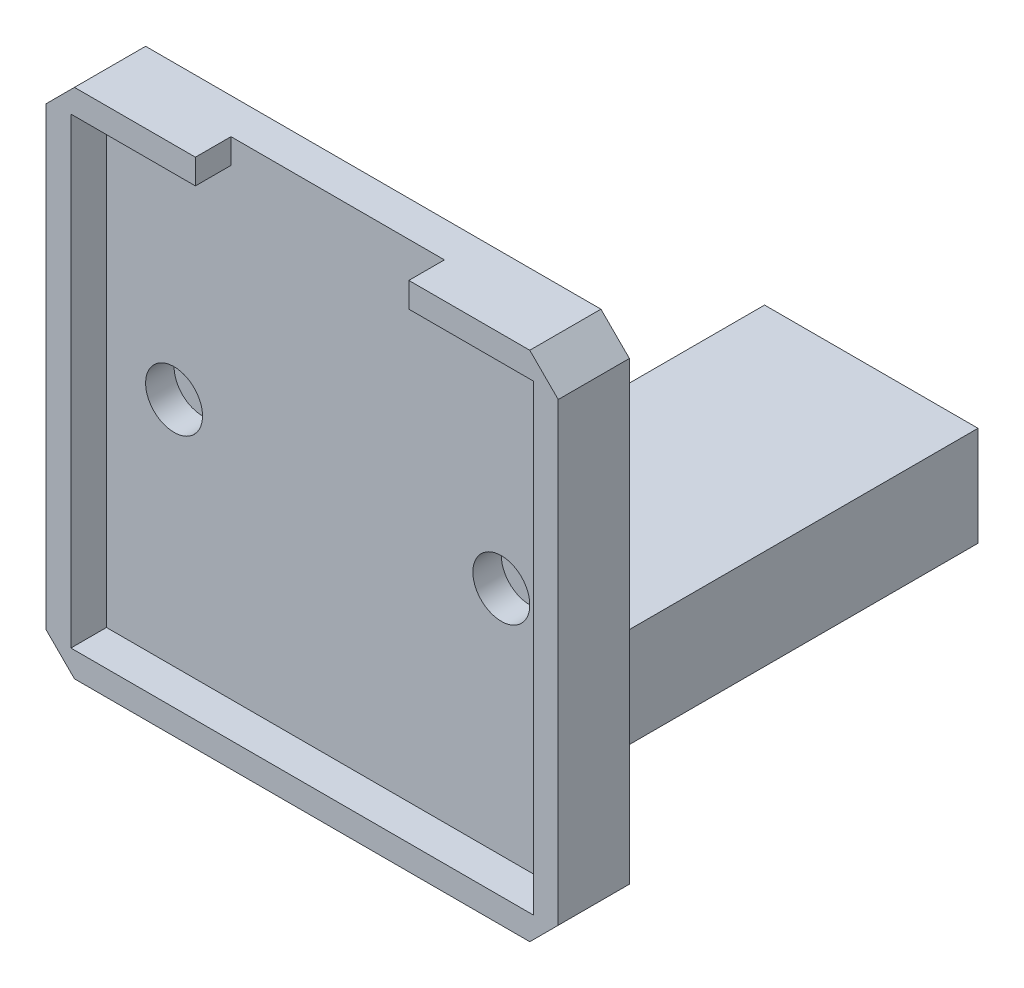
ISO-10303-21;
HEADER;
FILE_DESCRIPTION(('STEP AP214'),'2;1');
FILE_NAME('part.step','',(''),(''),'','','');
FILE_SCHEMA(('AUTOMOTIVE_DESIGN { 1 0 10303 214 1 1 1 1 }'));
ENDSEC;
DATA;
#1=APPLICATION_CONTEXT('core data for automotive mechanical design processes');
#2=APPLICATION_PROTOCOL_DEFINITION('international standard','automotive_design',2000,#1);
#3=PRODUCT_CONTEXT('',#1,'mechanical');
#4=PRODUCT('Part','Part','',(#3));
#5=PRODUCT_RELATED_PRODUCT_CATEGORY('part','',(#4));
#6=PRODUCT_DEFINITION_FORMATION('','',#4);
#7=PRODUCT_DEFINITION_CONTEXT('part definition',#1,'design');
#8=PRODUCT_DEFINITION('design','',#6,#7);
#9=PRODUCT_DEFINITION_SHAPE('','',#8);
#10=(LENGTH_UNIT() NAMED_UNIT(*) SI_UNIT(.MILLI.,.METRE.));
#11=(NAMED_UNIT(*) PLANE_ANGLE_UNIT() SI_UNIT($,.RADIAN.));
#12=(NAMED_UNIT(*) SI_UNIT($,.STERADIAN.) SOLID_ANGLE_UNIT());
#13=UNCERTAINTY_MEASURE_WITH_UNIT(LENGTH_MEASURE(1.E-05),#10,'distance_accuracy_value','');
#14=(GEOMETRIC_REPRESENTATION_CONTEXT(3) GLOBAL_UNCERTAINTY_ASSIGNED_CONTEXT((#13)) GLOBAL_UNIT_ASSIGNED_CONTEXT((#10,
#11,#12)) REPRESENTATION_CONTEXT('',''));
#15=CARTESIAN_POINT('',(0.,0.,0.));
#16=DIRECTION('',(0.,0.,1.));
#17=DIRECTION('',(1.,0.,0.));
#18=AXIS2_PLACEMENT_3D('',#15,#16,#17);
#19=CARTESIAN_POINT('',(-18.,18.,5.));
#20=DIRECTION('',(0.,-1.,0.));
#21=DIRECTION('',(0.,0.,-1.));
#22=AXIS2_PLACEMENT_3D('',#19,#20,#21);
#23=PLANE('',#22);
#24=DIRECTION('',(-1.,0.,0.));
#25=VECTOR('',#24,1.);
#26=CARTESIAN_POINT('',(-18.,18.,0.));
#27=LINE('',#26,#25);
#28=CARTESIAN_POINT('',(16.,18.,0.));
#29=VERTEX_POINT('',#28);
#30=CARTESIAN_POINT('',(-16.,18.,0.));
#31=VERTEX_POINT('',#30);
#32=EDGE_CURVE('E299',#29,#31,#27,.T.);
#33=ORIENTED_EDGE('',*,*,#32,.T.);
#34=DIRECTION('',(0.,0.,1.));
#35=VECTOR('',#34,1.);
#36=CARTESIAN_POINT('',(-16.,18.,5.));
#37=LINE('',#36,#35);
#38=CARTESIAN_POINT('',(-16.,18.,5.));
#39=VERTEX_POINT('',#38);
#40=EDGE_CURVE('E338',#31,#39,#37,.T.);
#41=ORIENTED_EDGE('',*,*,#40,.T.);
#42=DIRECTION('',(-1.,0.,0.));
#43=VECTOR('',#42,1.);
#44=CARTESIAN_POINT('',(-18.,18.,5.));
#45=LINE('',#44,#43);
#46=CARTESIAN_POINT('',(-7.5,18.,5.));
#47=VERTEX_POINT('',#46);
#48=EDGE_CURVE('E286',#47,#39,#45,.T.);
#49=ORIENTED_EDGE('',*,*,#48,.F.);
#50=DIRECTION('',(0.,0.,1.));
#51=VECTOR('',#50,1.);
#52=CARTESIAN_POINT('',(-7.5,18.,2.5));
#53=LINE('',#52,#51);
#54=CARTESIAN_POINT('',(-7.5,18.,2.5));
#55=VERTEX_POINT('',#54);
#56=EDGE_CURVE('E274',#55,#47,#53,.T.);
#57=ORIENTED_EDGE('',*,*,#56,.F.);
#58=DIRECTION('',(-1.,0.,0.));
#59=VECTOR('',#58,1.);
#60=CARTESIAN_POINT('',(0.,18.,2.5));
#61=LINE('',#60,#59);
#62=CARTESIAN_POINT('',(7.5,18.,2.5));
#63=VERTEX_POINT('',#62);
#64=EDGE_CURVE('E236',#63,#55,#61,.T.);
#65=ORIENTED_EDGE('',*,*,#64,.F.);
#66=DIRECTION('',(0.,0.,1.));
#67=VECTOR('',#66,1.);
#68=CARTESIAN_POINT('',(7.5,18.,2.5));
#69=LINE('',#68,#67);
#70=CARTESIAN_POINT('',(7.5,18.,5.));
#71=VERTEX_POINT('',#70);
#72=EDGE_CURVE('E276',#63,#71,#69,.T.);
#73=ORIENTED_EDGE('',*,*,#72,.T.);
#74=CARTESIAN_POINT('',(16.,18.,5.));
#75=VERTEX_POINT('',#74);
#76=EDGE_CURVE('E288',#75,#71,#45,.T.);
#77=ORIENTED_EDGE('',*,*,#76,.F.);
#78=DIRECTION('',(0.,0.,-1.));
#79=VECTOR('',#78,1.);
#80=CARTESIAN_POINT('',(16.,18.,5.));
#81=LINE('',#80,#79);
#82=EDGE_CURVE('E335',#75,#29,#81,.T.);
#83=ORIENTED_EDGE('',*,*,#82,.T.);
#84=EDGE_LOOP('',(#33,#41,#49,#57,#65,#73,#77,#83));
#85=FACE_BOUND('',#84,.T.);
#86=ADVANCED_FACE('F34',(#85),#23,.F.);
#87=CARTESIAN_POINT('',(0.,0.,5.));
#88=DIRECTION('',(0.,0.,1.));
#89=DIRECTION('',(1.,0.,0.));
#90=AXIS2_PLACEMENT_3D('',#87,#88,#89);
#91=PLANE('',#90);
#92=ORIENTED_EDGE('',*,*,#48,.T.);
#93=DIRECTION('',(0.707106781186549,0.707106781186546,0.));
#94=VECTOR('',#93,1.);
#95=CARTESIAN_POINT('',(-17.,17.,5.));
#96=LINE('',#95,#94);
#97=CARTESIAN_POINT('',(-18.,16.,5.));
#98=VERTEX_POINT('',#97);
#99=EDGE_CURVE('E346',#39,#98,#96,.F.);
#100=ORIENTED_EDGE('',*,*,#99,.T.);
#101=DIRECTION('',(0.,-1.,0.));
#102=VECTOR('',#101,1.);
#103=CARTESIAN_POINT('',(-18.,18.,5.));
#104=LINE('',#103,#102);
#105=CARTESIAN_POINT('',(-18.,-16.,5.));
#106=VERTEX_POINT('',#105);
#107=EDGE_CURVE('E290',#98,#106,#104,.T.);
#108=ORIENTED_EDGE('',*,*,#107,.T.);
#109=DIRECTION('',(-0.707106781186546,0.707106781186549,0.));
#110=VECTOR('',#109,1.);
#111=CARTESIAN_POINT('',(-17.,-17.,5.));
#112=LINE('',#111,#110);
#113=CARTESIAN_POINT('',(-16.,-18.,5.));
#114=VERTEX_POINT('',#113);
#115=EDGE_CURVE('E344',#106,#114,#112,.F.);
#116=ORIENTED_EDGE('',*,*,#115,.T.);
#117=DIRECTION('',(1.,0.,0.));
#118=VECTOR('',#117,1.);
#119=CARTESIAN_POINT('',(-18.,-18.,5.));
#120=LINE('',#119,#118);
#121=CARTESIAN_POINT('',(16.,-18.,5.));
#122=VERTEX_POINT('',#121);
#123=EDGE_CURVE('E293',#114,#122,#120,.T.);
#124=ORIENTED_EDGE('',*,*,#123,.T.);
#125=DIRECTION('',(-0.707106781186549,-0.707106781186546,0.));
#126=VECTOR('',#125,1.);
#127=CARTESIAN_POINT('',(17.,-17.,5.));
#128=LINE('',#127,#126);
#129=CARTESIAN_POINT('',(18.,-16.,5.));
#130=VERTEX_POINT('',#129);
#131=EDGE_CURVE('E342',#122,#130,#128,.F.);
#132=ORIENTED_EDGE('',*,*,#131,.T.);
#133=DIRECTION('',(0.,1.,0.));
#134=VECTOR('',#133,1.);
#135=CARTESIAN_POINT('',(18.,18.,5.));
#136=LINE('',#135,#134);
#137=CARTESIAN_POINT('',(18.,16.,5.));
#138=VERTEX_POINT('',#137);
#139=EDGE_CURVE('E283',#130,#138,#136,.T.);
#140=ORIENTED_EDGE('',*,*,#139,.T.);
#141=DIRECTION('',(0.707106781186546,-0.707106781186549,0.));
#142=VECTOR('',#141,1.);
#143=CARTESIAN_POINT('',(17.,17.,5.));
#144=LINE('',#143,#142);
#145=EDGE_CURVE('E340',#138,#75,#144,.F.);
#146=ORIENTED_EDGE('',*,*,#145,.T.);
#147=ORIENTED_EDGE('',*,*,#76,.T.);
#148=DIRECTION('',(0.,1.,0.));
#149=VECTOR('',#148,1.);
#150=CARTESIAN_POINT('',(7.5,0.,5.));
#151=LINE('',#150,#149);
#152=CARTESIAN_POINT('',(7.5,16.25,5.));
#153=VERTEX_POINT('',#152);
#154=EDGE_CURVE('E253',#153,#71,#151,.T.);
#155=ORIENTED_EDGE('',*,*,#154,.F.);
#156=DIRECTION('',(1.,0.,0.));
#157=VECTOR('',#156,1.);
#158=CARTESIAN_POINT('',(0.,16.25,5.));
#159=LINE('',#158,#157);
#160=CARTESIAN_POINT('',(16.25,16.25,5.));
#161=VERTEX_POINT('',#160);
#162=EDGE_CURVE('E250',#153,#161,#159,.T.);
#163=ORIENTED_EDGE('',*,*,#162,.T.);
#164=DIRECTION('',(0.,-1.,0.));
#165=VECTOR('',#164,1.);
#166=CARTESIAN_POINT('',(16.25,0.,5.));
#167=LINE('',#166,#165);
#168=CARTESIAN_POINT('',(16.25,-16.25,5.));
#169=VERTEX_POINT('',#168);
#170=EDGE_CURVE('E209',#161,#169,#167,.T.);
#171=ORIENTED_EDGE('',*,*,#170,.T.);
#172=DIRECTION('',(1.,0.,0.));
#173=VECTOR('',#172,1.);
#174=CARTESIAN_POINT('',(0.,-16.25,5.));
#175=LINE('',#174,#173);
#176=CARTESIAN_POINT('',(-16.25,-16.25,5.));
#177=VERTEX_POINT('',#176);
#178=EDGE_CURVE('E230',#177,#169,#175,.T.);
#179=ORIENTED_EDGE('',*,*,#178,.F.);
#180=DIRECTION('',(0.,-1.,0.));
#181=VECTOR('',#180,1.);
#182=CARTESIAN_POINT('',(-16.25,0.,5.));
#183=LINE('',#182,#181);
#184=CARTESIAN_POINT('',(-16.25,16.25,5.));
#185=VERTEX_POINT('',#184);
#186=EDGE_CURVE('E260',#185,#177,#183,.T.);
#187=ORIENTED_EDGE('',*,*,#186,.F.);
#188=CARTESIAN_POINT('',(-7.5,16.25,5.));
#189=VERTEX_POINT('',#188);
#190=EDGE_CURVE('E254',#185,#189,#159,.T.);
#191=ORIENTED_EDGE('',*,*,#190,.T.);
#192=DIRECTION('',(0.,1.,0.));
#193=VECTOR('',#192,1.);
#194=CARTESIAN_POINT('',(-7.5,0.,5.));
#195=LINE('',#194,#193);
#196=EDGE_CURVE('E257',#189,#47,#195,.T.);
#197=ORIENTED_EDGE('',*,*,#196,.T.);
#198=EDGE_LOOP('',(#92,#100,#108,#116,#124,#132,#140,#146,#147,#155,#163,#171,#179,#187,#191,#197));
#199=FACE_BOUND('',#198,.T.);
#200=ADVANCED_FACE('F390',(#199),#91,.T.);
#201=CARTESIAN_POINT('',(18.,18.,5.));
#202=DIRECTION('',(-1.,0.,0.));
#203=DIRECTION('',(0.,-1.,0.));
#204=AXIS2_PLACEMENT_3D('',#201,#202,#203);
#205=PLANE('',#204);
#206=ORIENTED_EDGE('',*,*,#139,.F.);
#207=DIRECTION('',(0.,0.,-1.));
#208=VECTOR('',#207,1.);
#209=CARTESIAN_POINT('',(18.,-16.,5.));
#210=LINE('',#209,#208);
#211=CARTESIAN_POINT('',(18.,-16.,0.));
#212=VERTEX_POINT('',#211);
#213=EDGE_CURVE('E355',#130,#212,#210,.T.);
#214=ORIENTED_EDGE('',*,*,#213,.T.);
#215=DIRECTION('',(0.,1.,0.));
#216=VECTOR('',#215,1.);
#217=CARTESIAN_POINT('',(18.,18.,0.));
#218=LINE('',#217,#216);
#219=CARTESIAN_POINT('',(18.,16.,0.));
#220=VERTEX_POINT('',#219);
#221=EDGE_CURVE('E267',#212,#220,#218,.T.);
#222=ORIENTED_EDGE('',*,*,#221,.T.);
#223=DIRECTION('',(0.,0.,1.));
#224=VECTOR('',#223,1.);
#225=CARTESIAN_POINT('',(18.,16.,5.));
#226=LINE('',#225,#224);
#227=EDGE_CURVE('E353',#220,#138,#226,.T.);
#228=ORIENTED_EDGE('',*,*,#227,.T.);
#229=EDGE_LOOP('',(#206,#214,#222,#228));
#230=FACE_BOUND('',#229,.T.);
#231=ADVANCED_FACE('F400',(#230),#205,.F.);
#232=CARTESIAN_POINT('',(-18.,18.,5.));
#233=DIRECTION('',(1.,0.,0.));
#234=DIRECTION('',(0.,1.,0.));
#235=AXIS2_PLACEMENT_3D('',#232,#233,#234);
#236=PLANE('',#235);
#237=ORIENTED_EDGE('',*,*,#107,.F.);
#238=DIRECTION('',(0.,0.,-1.));
#239=VECTOR('',#238,1.);
#240=CARTESIAN_POINT('',(-18.,16.,5.));
#241=LINE('',#240,#239);
#242=CARTESIAN_POINT('',(-18.,16.,0.));
#243=VERTEX_POINT('',#242);
#244=EDGE_CURVE('E324',#98,#243,#241,.T.);
#245=ORIENTED_EDGE('',*,*,#244,.T.);
#246=DIRECTION('',(0.,-1.,0.));
#247=VECTOR('',#246,1.);
#248=CARTESIAN_POINT('',(-18.,18.,0.));
#249=LINE('',#248,#247);
#250=CARTESIAN_POINT('',(-18.,-16.,0.));
#251=VERTEX_POINT('',#250);
#252=EDGE_CURVE('E302',#243,#251,#249,.T.);
#253=ORIENTED_EDGE('',*,*,#252,.T.);
#254=DIRECTION('',(0.,0.,1.));
#255=VECTOR('',#254,1.);
#256=CARTESIAN_POINT('',(-18.,-16.,5.));
#257=LINE('',#256,#255);
#258=EDGE_CURVE('E322',#251,#106,#257,.T.);
#259=ORIENTED_EDGE('',*,*,#258,.T.);
#260=EDGE_LOOP('',(#237,#245,#253,#259));
#261=FACE_BOUND('',#260,.T.);
#262=ADVANCED_FACE('F384',(#261),#236,.F.);
#263=CARTESIAN_POINT('',(-18.,-18.,5.));
#264=DIRECTION('',(0.,1.,0.));
#265=DIRECTION('',(0.,0.,1.));
#266=AXIS2_PLACEMENT_3D('',#263,#264,#265);
#267=PLANE('',#266);
#268=ORIENTED_EDGE('',*,*,#123,.F.);
#269=DIRECTION('',(0.,0.,-1.));
#270=VECTOR('',#269,1.);
#271=CARTESIAN_POINT('',(-16.,-18.,5.));
#272=LINE('',#271,#270);
#273=CARTESIAN_POINT('',(-16.,-18.,0.));
#274=VERTEX_POINT('',#273);
#275=EDGE_CURVE('E350',#114,#274,#272,.T.);
#276=ORIENTED_EDGE('',*,*,#275,.T.);
#277=DIRECTION('',(1.,0.,0.));
#278=VECTOR('',#277,1.);
#279=CARTESIAN_POINT('',(-18.,-18.,0.));
#280=LINE('',#279,#278);
#281=CARTESIAN_POINT('',(-12.5,-18.,0.));
#282=VERTEX_POINT('',#281);
#283=EDGE_CURVE('E287',#274,#282,#280,.T.);
#284=ORIENTED_EDGE('',*,*,#283,.T.);
#285=DIRECTION('',(-0.707106781186551,0.,0.707106781186544));
#286=VECTOR('',#285,1.);
#287=CARTESIAN_POINT('',(-17.75,-18.,5.24999999999995));
#288=LINE('',#287,#286);
#289=CARTESIAN_POINT('',(-7.5,-18.,-4.99999999999999));
#290=VERTEX_POINT('',#289);
#291=EDGE_CURVE('E314',#282,#290,#288,.F.);
#292=ORIENTED_EDGE('',*,*,#291,.T.);
#293=DIRECTION('',(0.,0.,-1.));
#294=VECTOR('',#293,1.);
#295=CARTESIAN_POINT('',(-7.5,-18.,0.));
#296=LINE('',#295,#294);
#297=CARTESIAN_POINT('',(-7.5,-18.,-35.));
#298=VERTEX_POINT('',#297);
#299=EDGE_CURVE('E206',#290,#298,#296,.T.);
#300=ORIENTED_EDGE('',*,*,#299,.T.);
#301=DIRECTION('',(-1.,0.,0.));
#302=VECTOR('',#301,1.);
#303=CARTESIAN_POINT('',(7.5,-18.,-35.));
#304=LINE('',#303,#302);
#305=CARTESIAN_POINT('',(7.5,-18.,-35.));
#306=VERTEX_POINT('',#305);
#307=EDGE_CURVE('E202',#306,#298,#304,.T.);
#308=ORIENTED_EDGE('',*,*,#307,.F.);
#309=DIRECTION('',(0.,0.,-1.));
#310=VECTOR('',#309,1.);
#311=CARTESIAN_POINT('',(7.5,-18.,0.));
#312=LINE('',#311,#310);
#313=CARTESIAN_POINT('',(7.5,-18.,-5.00000000000004));
#314=VERTEX_POINT('',#313);
#315=EDGE_CURVE('E189',#314,#306,#312,.T.);
#316=ORIENTED_EDGE('',*,*,#315,.F.);
#317=DIRECTION('',(0.707106781186544,0.,0.707106781186551));
#318=VECTOR('',#317,1.);
#319=CARTESIAN_POINT('',(-0.249999999999841,-18.,-12.75));
#320=LINE('',#319,#318);
#321=CARTESIAN_POINT('',(12.5,-18.,0.));
#322=VERTEX_POINT('',#321);
#323=EDGE_CURVE('E318',#314,#322,#320,.T.);
#324=ORIENTED_EDGE('',*,*,#323,.T.);
#325=CARTESIAN_POINT('',(16.,-18.,0.));
#326=VERTEX_POINT('',#325);
#327=EDGE_CURVE('E305',#322,#326,#280,.T.);
#328=ORIENTED_EDGE('',*,*,#327,.T.);
#329=DIRECTION('',(0.,0.,1.));
#330=VECTOR('',#329,1.);
#331=CARTESIAN_POINT('',(16.,-18.,5.));
#332=LINE('',#331,#330);
#333=EDGE_CURVE('E348',#326,#122,#332,.T.);
#334=ORIENTED_EDGE('',*,*,#333,.T.);
#335=EDGE_LOOP('',(#268,#276,#284,#292,#300,#308,#316,#324,#328,#334));
#336=FACE_BOUND('',#335,.T.);
#337=ADVANCED_FACE('F204',(#336),#267,.F.);
#338=CARTESIAN_POINT('',(0.,0.,0.));
#339=DIRECTION('',(0.,0.,1.));
#340=DIRECTION('',(1.,0.,0.));
#341=AXIS2_PLACEMENT_3D('',#338,#339,#340);
#342=PLANE('',#341);
#343=DIRECTION('',(-1.,0.,0.));
#344=VECTOR('',#343,1.);
#345=CARTESIAN_POINT('',(-12.5,-8.99999999999998,0.));
#346=LINE('',#345,#344);
#347=CARTESIAN_POINT('',(12.5,-8.99999999999998,0.));
#348=VERTEX_POINT('',#347);
#349=CARTESIAN_POINT('',(-12.5,-8.99999999999998,0.));
#350=VERTEX_POINT('',#349);
#351=EDGE_CURVE('E358',#348,#350,#346,.T.);
#352=ORIENTED_EDGE('',*,*,#351,.T.);
#353=DIRECTION('',(0.,-1.,0.));
#354=VECTOR('',#353,1.);
#355=CARTESIAN_POINT('',(-12.5,-18.,0.));
#356=LINE('',#355,#354);
#357=EDGE_CURVE('E308',#350,#282,#356,.T.);
#358=ORIENTED_EDGE('',*,*,#357,.T.);
#359=ORIENTED_EDGE('',*,*,#283,.F.);
#360=DIRECTION('',(0.707106781186546,-0.707106781186549,0.));
#361=VECTOR('',#360,1.);
#362=CARTESIAN_POINT('',(-16.,-18.,0.));
#363=LINE('',#362,#361);
#364=EDGE_CURVE('E331',#274,#251,#363,.F.);
#365=ORIENTED_EDGE('',*,*,#364,.T.);
#366=ORIENTED_EDGE('',*,*,#252,.F.);
#367=DIRECTION('',(-0.707106781186549,-0.707106781186546,0.));
#368=VECTOR('',#367,1.);
#369=CARTESIAN_POINT('',(-18.,16.,0.));
#370=LINE('',#369,#368);
#371=EDGE_CURVE('E333',#243,#31,#370,.F.);
#372=ORIENTED_EDGE('',*,*,#371,.T.);
#373=ORIENTED_EDGE('',*,*,#32,.F.);
#374=DIRECTION('',(-0.707106781186546,0.707106781186549,0.));
#375=VECTOR('',#374,1.);
#376=CARTESIAN_POINT('',(16.,18.,0.));
#377=LINE('',#376,#375);
#378=EDGE_CURVE('E327',#29,#220,#377,.F.);
#379=ORIENTED_EDGE('',*,*,#378,.T.);
#380=ORIENTED_EDGE('',*,*,#221,.F.);
#381=DIRECTION('',(0.707106781186549,0.707106781186546,0.));
#382=VECTOR('',#381,1.);
#383=CARTESIAN_POINT('',(18.,-16.,0.));
#384=LINE('',#383,#382);
#385=EDGE_CURVE('E329',#212,#326,#384,.F.);
#386=ORIENTED_EDGE('',*,*,#385,.T.);
#387=ORIENTED_EDGE('',*,*,#327,.F.);
#388=DIRECTION('',(0.,1.,0.));
#389=VECTOR('',#388,1.);
#390=CARTESIAN_POINT('',(12.5,0.,0.));
#391=LINE('',#390,#389);
#392=EDGE_CURVE('E296',#322,#348,#391,.T.);
#393=ORIENTED_EDGE('',*,*,#392,.T.);
#394=EDGE_LOOP('',(#352,#358,#359,#365,#366,#372,#373,#379,#380,#386,#387,#393));
#395=FACE_BOUND('',#394,.T.);
#396=ADVANCED_FACE('F363',(#395),#342,.F.);
#397=CARTESIAN_POINT('',(16.25,0.,2.5));
#398=DIRECTION('',(-1.,0.,0.));
#399=DIRECTION('',(0.,-1.,0.));
#400=AXIS2_PLACEMENT_3D('',#397,#398,#399);
#401=PLANE('',#400);
#402=ORIENTED_EDGE('',*,*,#170,.F.);
#403=DIRECTION('',(0.,0.,1.));
#404=VECTOR('',#403,1.);
#405=CARTESIAN_POINT('',(16.25,16.25,2.5));
#406=LINE('',#405,#404);
#407=CARTESIAN_POINT('',(16.25,16.25,2.5));
#408=VERTEX_POINT('',#407);
#409=EDGE_CURVE('E247',#408,#161,#406,.T.);
#410=ORIENTED_EDGE('',*,*,#409,.F.);
#411=DIRECTION('',(0.,-1.,0.));
#412=VECTOR('',#411,1.);
#413=CARTESIAN_POINT('',(16.25,0.,2.5));
#414=LINE('',#413,#412);
#415=CARTESIAN_POINT('',(16.25,-16.25,2.5));
#416=VERTEX_POINT('',#415);
#417=EDGE_CURVE('E227',#408,#416,#414,.T.);
#418=ORIENTED_EDGE('',*,*,#417,.T.);
#419=DIRECTION('',(0.,0.,1.));
#420=VECTOR('',#419,1.);
#421=CARTESIAN_POINT('',(16.25,-16.25,2.5));
#422=LINE('',#421,#420);
#423=EDGE_CURVE('E265',#416,#169,#422,.T.);
#424=ORIENTED_EDGE('',*,*,#423,.T.);
#425=EDGE_LOOP('',(#402,#410,#418,#424));
#426=FACE_BOUND('',#425,.T.);
#427=ADVANCED_FACE('F425',(#426),#401,.T.);
#428=CARTESIAN_POINT('',(0.,-16.25,2.5));
#429=DIRECTION('',(0.,-1.,0.));
#430=DIRECTION('',(0.,0.,-1.));
#431=AXIS2_PLACEMENT_3D('',#428,#429,#430);
#432=PLANE('',#431);
#433=ORIENTED_EDGE('',*,*,#178,.T.);
#434=ORIENTED_EDGE('',*,*,#423,.F.);
#435=DIRECTION('',(1.,0.,0.));
#436=VECTOR('',#435,1.);
#437=CARTESIAN_POINT('',(0.,-16.25,2.5));
#438=LINE('',#437,#436);
#439=CARTESIAN_POINT('',(-16.25,-16.25,2.5));
#440=VERTEX_POINT('',#439);
#441=EDGE_CURVE('E244',#440,#416,#438,.T.);
#442=ORIENTED_EDGE('',*,*,#441,.F.);
#443=DIRECTION('',(0.,0.,1.));
#444=VECTOR('',#443,1.);
#445=CARTESIAN_POINT('',(-16.25,-16.25,2.5));
#446=LINE('',#445,#444);
#447=EDGE_CURVE('E268',#440,#177,#446,.T.);
#448=ORIENTED_EDGE('',*,*,#447,.T.);
#449=EDGE_LOOP('',(#433,#434,#442,#448));
#450=FACE_BOUND('',#449,.T.);
#451=ADVANCED_FACE('F431',(#450),#432,.F.);
#452=CARTESIAN_POINT('',(-16.25,0.,2.5));
#453=DIRECTION('',(-1.,0.,0.));
#454=DIRECTION('',(0.,-1.,0.));
#455=AXIS2_PLACEMENT_3D('',#452,#453,#454);
#456=PLANE('',#455);
#457=ORIENTED_EDGE('',*,*,#186,.T.);
#458=ORIENTED_EDGE('',*,*,#447,.F.);
#459=DIRECTION('',(0.,-1.,0.));
#460=VECTOR('',#459,1.);
#461=CARTESIAN_POINT('',(-16.25,0.,2.5));
#462=LINE('',#461,#460);
#463=CARTESIAN_POINT('',(-16.25,16.25,2.5));
#464=VERTEX_POINT('',#463);
#465=EDGE_CURVE('E241',#464,#440,#462,.T.);
#466=ORIENTED_EDGE('',*,*,#465,.F.);
#467=DIRECTION('',(0.,0.,1.));
#468=VECTOR('',#467,1.);
#469=CARTESIAN_POINT('',(-16.25,16.25,2.5));
#470=LINE('',#469,#468);
#471=EDGE_CURVE('E270',#464,#185,#470,.T.);
#472=ORIENTED_EDGE('',*,*,#471,.T.);
#473=EDGE_LOOP('',(#457,#458,#466,#472));
#474=FACE_BOUND('',#473,.T.);
#475=ADVANCED_FACE('F435',(#474),#456,.F.);
#476=CARTESIAN_POINT('',(0.,16.25,2.5));
#477=DIRECTION('',(0.,-1.,0.));
#478=DIRECTION('',(0.,0.,-1.));
#479=AXIS2_PLACEMENT_3D('',#476,#477,#478);
#480=PLANE('',#479);
#481=ORIENTED_EDGE('',*,*,#190,.F.);
#482=ORIENTED_EDGE('',*,*,#471,.F.);
#483=DIRECTION('',(1.,0.,0.));
#484=VECTOR('',#483,1.);
#485=CARTESIAN_POINT('',(0.,16.25,2.5));
#486=LINE('',#485,#484);
#487=CARTESIAN_POINT('',(-7.5,16.25,2.5));
#488=VERTEX_POINT('',#487);
#489=EDGE_CURVE('E233',#464,#488,#486,.T.);
#490=ORIENTED_EDGE('',*,*,#489,.T.);
#491=DIRECTION('',(0.,0.,1.));
#492=VECTOR('',#491,1.);
#493=CARTESIAN_POINT('',(-7.5,16.25,2.5));
#494=LINE('',#493,#492);
#495=EDGE_CURVE('E272',#488,#189,#494,.T.);
#496=ORIENTED_EDGE('',*,*,#495,.T.);
#497=EDGE_LOOP('',(#481,#482,#490,#496));
#498=FACE_BOUND('',#497,.T.);
#499=ADVANCED_FACE('F439',(#498),#480,.T.);
#500=CARTESIAN_POINT('',(-7.5,0.,2.5));
#501=DIRECTION('',(1.,0.,0.));
#502=DIRECTION('',(0.,0.,-1.));
#503=AXIS2_PLACEMENT_3D('',#500,#501,#502);
#504=PLANE('',#503);
#505=ORIENTED_EDGE('',*,*,#196,.F.);
#506=ORIENTED_EDGE('',*,*,#495,.F.);
#507=DIRECTION('',(0.,1.,0.));
#508=VECTOR('',#507,1.);
#509=CARTESIAN_POINT('',(-7.5,0.,2.5));
#510=LINE('',#509,#508);
#511=EDGE_CURVE('E239',#488,#55,#510,.T.);
#512=ORIENTED_EDGE('',*,*,#511,.T.);
#513=ORIENTED_EDGE('',*,*,#56,.T.);
#514=EDGE_LOOP('',(#505,#506,#512,#513));
#515=FACE_BOUND('',#514,.T.);
#516=ADVANCED_FACE('F491',(#515),#504,.T.);
#517=CARTESIAN_POINT('',(7.5,0.,2.5));
#518=DIRECTION('',(1.,0.,0.));
#519=DIRECTION('',(0.,0.,-1.));
#520=AXIS2_PLACEMENT_3D('',#517,#518,#519);
#521=PLANE('',#520);
#522=ORIENTED_EDGE('',*,*,#154,.T.);
#523=ORIENTED_EDGE('',*,*,#72,.F.);
#524=DIRECTION('',(0.,1.,0.));
#525=VECTOR('',#524,1.);
#526=CARTESIAN_POINT('',(7.5,0.,2.5));
#527=LINE('',#526,#525);
#528=CARTESIAN_POINT('',(7.5,16.25,2.5));
#529=VERTEX_POINT('',#528);
#530=EDGE_CURVE('E232',#529,#63,#527,.T.);
#531=ORIENTED_EDGE('',*,*,#530,.F.);
#532=DIRECTION('',(0.,0.,1.));
#533=VECTOR('',#532,1.);
#534=CARTESIAN_POINT('',(7.5,16.25,2.5));
#535=LINE('',#534,#533);
#536=EDGE_CURVE('E279',#529,#153,#535,.T.);
#537=ORIENTED_EDGE('',*,*,#536,.T.);
#538=EDGE_LOOP('',(#522,#523,#531,#537));
#539=FACE_BOUND('',#538,.T.);
#540=ADVANCED_FACE('F414',(#539),#521,.F.);
#541=ORIENTED_EDGE('',*,*,#162,.F.);
#542=ORIENTED_EDGE('',*,*,#536,.F.);
#543=EDGE_CURVE('E229',#529,#408,#486,.T.);
#544=ORIENTED_EDGE('',*,*,#543,.T.);
#545=ORIENTED_EDGE('',*,*,#409,.T.);
#546=EDGE_LOOP('',(#541,#542,#544,#545));
#547=FACE_BOUND('',#546,.T.);
#548=ADVANCED_FACE('F423',(#547),#480,.T.);
#549=CARTESIAN_POINT('',(0.,0.,2.5));
#550=DIRECTION('',(0.,0.,1.));
#551=DIRECTION('',(1.,0.,0.));
#552=AXIS2_PLACEMENT_3D('',#549,#550,#551);
#553=PLANE('',#552);
#554=CARTESIAN_POINT('',(-11.5,0.,2.5));
#555=DIRECTION('',(0.,0.,1.));
#556=DIRECTION('',(1.,0.,0.));
#557=AXIS2_PLACEMENT_3D('',#554,#555,#556);
#558=CIRCLE('',#557,2.);
#559=CARTESIAN_POINT('',(-9.5,0.,2.5));
#560=VERTEX_POINT('',#559);
#561=EDGE_CURVE('E703',#560,#560,#558,.T.);
#562=ORIENTED_EDGE('',*,*,#561,.F.);
#563=EDGE_LOOP('',(#562));
#564=FACE_BOUND('',#563,.T.);
#565=CARTESIAN_POINT('',(11.5,0.,2.5));
#566=DIRECTION('',(0.,0.,1.));
#567=DIRECTION('',(-1.,0.,0.));
#568=AXIS2_PLACEMENT_3D('',#565,#566,#567);
#569=CIRCLE('',#568,2.);
#570=CARTESIAN_POINT('',(9.50000000000002,0.,2.5));
#571=VERTEX_POINT('',#570);
#572=EDGE_CURVE('E701',#571,#571,#569,.T.);
#573=ORIENTED_EDGE('',*,*,#572,.F.);
#574=EDGE_LOOP('',(#573));
#575=FACE_BOUND('',#574,.T.);
#576=ORIENTED_EDGE('',*,*,#417,.F.);
#577=ORIENTED_EDGE('',*,*,#543,.F.);
#578=ORIENTED_EDGE('',*,*,#530,.T.);
#579=ORIENTED_EDGE('',*,*,#64,.T.);
#580=ORIENTED_EDGE('',*,*,#511,.F.);
#581=ORIENTED_EDGE('',*,*,#489,.F.);
#582=ORIENTED_EDGE('',*,*,#465,.T.);
#583=ORIENTED_EDGE('',*,*,#441,.T.);
#584=EDGE_LOOP('',(#576,#577,#578,#579,#580,#581,#582,#583));
#585=FACE_BOUND('',#584,.T.);
#586=ADVANCED_FACE('F418',(#564,#575,#585),#553,.T.);
#587=CARTESIAN_POINT('',(7.5,-18.,-35.));
#588=DIRECTION('',(0.,0.,1.));
#589=DIRECTION('',(1.,0.,0.));
#590=AXIS2_PLACEMENT_3D('',#587,#588,#589);
#591=PLANE('',#590);
#592=DIRECTION('',(0.,1.,0.));
#593=VECTOR('',#592,1.);
#594=CARTESIAN_POINT('',(-7.5,-18.,-35.));
#595=LINE('',#594,#593);
#596=CARTESIAN_POINT('',(-7.5,-11.,-35.));
#597=VERTEX_POINT('',#596);
#598=EDGE_CURVE('E221',#298,#597,#595,.T.);
#599=ORIENTED_EDGE('',*,*,#598,.T.);
#600=DIRECTION('',(-1.,0.,0.));
#601=VECTOR('',#600,1.);
#602=CARTESIAN_POINT('',(7.5,-11.,-35.));
#603=LINE('',#602,#601);
#604=CARTESIAN_POINT('',(7.5,-11.,-35.));
#605=VERTEX_POINT('',#604);
#606=EDGE_CURVE('E210',#605,#597,#603,.T.);
#607=ORIENTED_EDGE('',*,*,#606,.F.);
#608=DIRECTION('',(0.,1.,0.));
#609=VECTOR('',#608,1.);
#610=CARTESIAN_POINT('',(7.5,-18.,-35.));
#611=LINE('',#610,#609);
#612=EDGE_CURVE('E194',#306,#605,#611,.T.);
#613=ORIENTED_EDGE('',*,*,#612,.F.);
#614=ORIENTED_EDGE('',*,*,#307,.T.);
#615=EDGE_LOOP('',(#599,#607,#613,#614));
#616=FACE_BOUND('',#615,.T.);
#617=ADVANCED_FACE('F212',(#616),#591,.F.);
#618=CARTESIAN_POINT('',(7.5,-11.,0.));
#619=DIRECTION('',(0.,-1.,0.));
#620=DIRECTION('',(0.,0.,-1.));
#621=AXIS2_PLACEMENT_3D('',#618,#619,#620);
#622=PLANE('',#621);
#623=DIRECTION('',(0.707106781186551,0.,-0.707106781186544));
#624=VECTOR('',#623,1.);
#625=CARTESIAN_POINT('',(-2.49999999999992,-11.,-10.));
#626=LINE('',#625,#624);
#627=CARTESIAN_POINT('',(-7.5,-11.,-4.99999999999999));
#628=VERTEX_POINT('',#627);
#629=CARTESIAN_POINT('',(-10.5,-11.,-2.));
#630=VERTEX_POINT('',#629);
#631=EDGE_CURVE('E316',#628,#630,#626,.F.);
#632=ORIENTED_EDGE('',*,*,#631,.T.);
#633=DIRECTION('',(1.,0.,0.));
#634=VECTOR('',#633,1.);
#635=CARTESIAN_POINT('',(12.5,-11.,-2.));
#636=LINE('',#635,#634);
#637=CARTESIAN_POINT('',(10.5,-11.,-2.));
#638=VERTEX_POINT('',#637);
#639=EDGE_CURVE('E49',#630,#638,#636,.T.);
#640=ORIENTED_EDGE('',*,*,#639,.T.);
#641=DIRECTION('',(-0.707106781186544,0.,-0.707106781186551));
#642=VECTOR('',#641,1.);
#643=CARTESIAN_POINT('',(10.,-11.,-2.49999999999999));
#644=LINE('',#643,#642);
#645=CARTESIAN_POINT('',(7.5,-11.,-5.00000000000004));
#646=VERTEX_POINT('',#645);
#647=EDGE_CURVE('E320',#638,#646,#644,.T.);
#648=ORIENTED_EDGE('',*,*,#647,.T.);
#649=DIRECTION('',(0.,0.,1.));
#650=VECTOR('',#649,1.);
#651=CARTESIAN_POINT('',(7.5,-11.,0.));
#652=LINE('',#651,#650);
#653=EDGE_CURVE('E215',#605,#646,#652,.T.);
#654=ORIENTED_EDGE('',*,*,#653,.F.);
#655=ORIENTED_EDGE('',*,*,#606,.T.);
#656=DIRECTION('',(0.,0.,1.));
#657=VECTOR('',#656,1.);
#658=CARTESIAN_POINT('',(-7.5,-11.,0.));
#659=LINE('',#658,#657);
#660=EDGE_CURVE('E199',#597,#628,#659,.T.);
#661=ORIENTED_EDGE('',*,*,#660,.T.);
#662=EDGE_LOOP('',(#632,#640,#648,#654,#655,#661));
#663=FACE_BOUND('',#662,.T.);
#664=ADVANCED_FACE('F371',(#663),#622,.F.);
#665=CARTESIAN_POINT('',(7.5,0.,0.));
#666=DIRECTION('',(1.,0.,0.));
#667=DIRECTION('',(0.,0.,-1.));
#668=AXIS2_PLACEMENT_3D('',#665,#666,#667);
#669=PLANE('',#668);
#670=ORIENTED_EDGE('',*,*,#653,.T.);
#671=DIRECTION('',(0.,-1.,0.));
#672=VECTOR('',#671,1.);
#673=CARTESIAN_POINT('',(7.5,0.,-5.00000000000004));
#674=LINE('',#673,#672);
#675=EDGE_CURVE('E197',#646,#314,#674,.T.);
#676=ORIENTED_EDGE('',*,*,#675,.T.);
#677=ORIENTED_EDGE('',*,*,#315,.T.);
#678=ORIENTED_EDGE('',*,*,#612,.T.);
#679=EDGE_LOOP('',(#670,#676,#677,#678));
#680=FACE_BOUND('',#679,.T.);
#681=ADVANCED_FACE('F192',(#680),#669,.T.);
#682=CARTESIAN_POINT('',(-7.5,0.,0.));
#683=DIRECTION('',(1.,0.,0.));
#684=DIRECTION('',(0.,0.,-1.));
#685=AXIS2_PLACEMENT_3D('',#682,#683,#684);
#686=PLANE('',#685);
#687=ORIENTED_EDGE('',*,*,#299,.F.);
#688=DIRECTION('',(0.,1.,0.));
#689=VECTOR('',#688,1.);
#690=CARTESIAN_POINT('',(-7.5,-11.,-4.99999999999999));
#691=LINE('',#690,#689);
#692=EDGE_CURVE('E311',#290,#628,#691,.T.);
#693=ORIENTED_EDGE('',*,*,#692,.T.);
#694=ORIENTED_EDGE('',*,*,#660,.F.);
#695=ORIENTED_EDGE('',*,*,#598,.F.);
#696=EDGE_LOOP('',(#687,#693,#694,#695));
#697=FACE_BOUND('',#696,.T.);
#698=ADVANCED_FACE('F374',(#697),#686,.F.);
#699=CARTESIAN_POINT('',(-12.5,0.,0.));
#700=DIRECTION('',(-0.707106781186544,0.,-0.707106781186551));
#701=DIRECTION('',(0.,1.,0.));
#702=AXIS2_PLACEMENT_3D('',#699,#700,#701);
#703=PLANE('',#702);
#704=ORIENTED_EDGE('',*,*,#631,.F.);
#705=ORIENTED_EDGE('',*,*,#692,.F.);
#706=ORIENTED_EDGE('',*,*,#291,.F.);
#707=ORIENTED_EDGE('',*,*,#357,.F.);
#708=DIRECTION('',(0.577350269189627,-0.577350269189628,-0.577350269189622));
#709=VECTOR('',#708,1.);
#710=CARTESIAN_POINT('',(-15.5000000000001,-5.99999999999996,2.99999999999998));
#711=LINE('',#710,#709);
#712=EDGE_CURVE('E42',#350,#630,#711,.T.);
#713=ORIENTED_EDGE('',*,*,#712,.T.);
#714=EDGE_LOOP('',(#704,#705,#706,#707,#713));
#715=FACE_BOUND('',#714,.T.);
#716=ADVANCED_FACE('F377',(#715),#703,.T.);
#717=CARTESIAN_POINT('',(7.5,0.,-5.00000000000004));
#718=DIRECTION('',(-0.707106781186552,0.,0.707106781186544));
#719=DIRECTION('',(0.,-1.,0.));
#720=AXIS2_PLACEMENT_3D('',#717,#718,#719);
#721=PLANE('',#720);
#722=ORIENTED_EDGE('',*,*,#647,.F.);
#723=DIRECTION('',(-0.57735026918962,-0.577350269189632,-0.577350269189626));
#724=VECTOR('',#723,1.);
#725=CARTESIAN_POINT('',(12.1666666666667,-9.33333333333328,-0.333333333333299));
#726=LINE('',#725,#724);
#727=EDGE_CURVE('E12',#638,#348,#726,.F.);
#728=ORIENTED_EDGE('',*,*,#727,.T.);
#729=ORIENTED_EDGE('',*,*,#392,.F.);
#730=ORIENTED_EDGE('',*,*,#323,.F.);
#731=ORIENTED_EDGE('',*,*,#675,.F.);
#732=EDGE_LOOP('',(#722,#728,#729,#730,#731));
#733=FACE_BOUND('',#732,.T.);
#734=ADVANCED_FACE('F370',(#733),#721,.F.);
#735=CARTESIAN_POINT('',(-18.,16.,5.));
#736=DIRECTION('',(0.707106781186546,-0.707106781186549,0.));
#737=DIRECTION('',(0.,0.,-1.));
#738=AXIS2_PLACEMENT_3D('',#735,#736,#737);
#739=PLANE('',#738);
#740=ORIENTED_EDGE('',*,*,#99,.F.);
#741=ORIENTED_EDGE('',*,*,#40,.F.);
#742=ORIENTED_EDGE('',*,*,#371,.F.);
#743=ORIENTED_EDGE('',*,*,#244,.F.);
#744=EDGE_LOOP('',(#740,#741,#742,#743));
#745=FACE_BOUND('',#744,.T.);
#746=ADVANCED_FACE('F447',(#745),#739,.F.);
#747=CARTESIAN_POINT('',(-16.,-18.,5.));
#748=DIRECTION('',(0.707106781186549,0.707106781186546,0.));
#749=DIRECTION('',(0.,0.,-1.));
#750=AXIS2_PLACEMENT_3D('',#747,#748,#749);
#751=PLANE('',#750);
#752=ORIENTED_EDGE('',*,*,#115,.F.);
#753=ORIENTED_EDGE('',*,*,#258,.F.);
#754=ORIENTED_EDGE('',*,*,#364,.F.);
#755=ORIENTED_EDGE('',*,*,#275,.F.);
#756=EDGE_LOOP('',(#752,#753,#754,#755));
#757=FACE_BOUND('',#756,.T.);
#758=ADVANCED_FACE('F387',(#757),#751,.F.);
#759=CARTESIAN_POINT('',(18.,-16.,5.));
#760=DIRECTION('',(-0.707106781186546,0.707106781186549,0.));
#761=DIRECTION('',(0.,0.,-1.));
#762=AXIS2_PLACEMENT_3D('',#759,#760,#761);
#763=PLANE('',#762);
#764=ORIENTED_EDGE('',*,*,#131,.F.);
#765=ORIENTED_EDGE('',*,*,#333,.F.);
#766=ORIENTED_EDGE('',*,*,#385,.F.);
#767=ORIENTED_EDGE('',*,*,#213,.F.);
#768=EDGE_LOOP('',(#764,#765,#766,#767));
#769=FACE_BOUND('',#768,.T.);
#770=ADVANCED_FACE('F395',(#769),#763,.F.);
#771=CARTESIAN_POINT('',(16.,18.,5.));
#772=DIRECTION('',(-0.707106781186549,-0.707106781186546,0.));
#773=DIRECTION('',(0.,0.,-1.));
#774=AXIS2_PLACEMENT_3D('',#771,#772,#773);
#775=PLANE('',#774);
#776=ORIENTED_EDGE('',*,*,#145,.F.);
#777=ORIENTED_EDGE('',*,*,#227,.F.);
#778=ORIENTED_EDGE('',*,*,#378,.F.);
#779=ORIENTED_EDGE('',*,*,#82,.F.);
#780=EDGE_LOOP('',(#776,#777,#778,#779));
#781=FACE_BOUND('',#780,.T.);
#782=ADVANCED_FACE('F404',(#781),#775,.F.);
#783=CARTESIAN_POINT('',(11.5,0.,0.5));
#784=DIRECTION('',(0.,0.,1.));
#785=DIRECTION('',(1.,0.,0.));
#786=AXIS2_PLACEMENT_3D('',#783,#784,#785);
#787=CYLINDRICAL_SURFACE('',#786,2.);
#788=CARTESIAN_POINT('',(11.5,0.,0.5));
#789=DIRECTION('',(0.,0.,1.));
#790=DIRECTION('',(-1.,0.,0.));
#791=AXIS2_PLACEMENT_3D('',#788,#789,#790);
#792=CIRCLE('',#791,2.);
#793=CARTESIAN_POINT('',(9.50000000000002,0.,0.5));
#794=VERTEX_POINT('',#793);
#795=EDGE_CURVE('E698',#794,#794,#792,.T.);
#796=ORIENTED_EDGE('',*,*,#795,.F.);
#797=EDGE_LOOP('',(#796));
#798=FACE_BOUND('',#797,.T.);
#799=ORIENTED_EDGE('',*,*,#572,.T.);
#800=EDGE_LOOP('',(#799));
#801=FACE_BOUND('',#800,.T.);
#802=ADVANCED_FACE('F636',(#798,#801),#787,.F.);
#803=CARTESIAN_POINT('',(11.5,0.,0.5));
#804=DIRECTION('',(0.,0.,-1.));
#805=DIRECTION('',(-1.,0.,0.));
#806=AXIS2_PLACEMENT_3D('',#803,#804,#805);
#807=PLANE('',#806);
#808=ORIENTED_EDGE('',*,*,#795,.T.);
#809=EDGE_LOOP('',(#808));
#810=FACE_BOUND('',#809,.T.);
#811=ADVANCED_FACE('F628',(#810),#807,.F.);
#812=CARTESIAN_POINT('',(-11.5,0.,0.5));
#813=DIRECTION('',(0.,0.,1.));
#814=DIRECTION('',(1.,0.,0.));
#815=AXIS2_PLACEMENT_3D('',#812,#813,#814);
#816=CYLINDRICAL_SURFACE('',#815,2.);
#817=CARTESIAN_POINT('',(-11.5,0.,0.5));
#818=DIRECTION('',(0.,0.,1.));
#819=DIRECTION('',(1.,0.,0.));
#820=AXIS2_PLACEMENT_3D('',#817,#818,#819);
#821=CIRCLE('',#820,2.);
#822=CARTESIAN_POINT('',(-9.5,0.,0.5));
#823=VERTEX_POINT('',#822);
#824=EDGE_CURVE('E222',#823,#823,#821,.T.);
#825=ORIENTED_EDGE('',*,*,#824,.F.);
#826=EDGE_LOOP('',(#825));
#827=FACE_BOUND('',#826,.T.);
#828=ORIENTED_EDGE('',*,*,#561,.T.);
#829=EDGE_LOOP('',(#828));
#830=FACE_BOUND('',#829,.T.);
#831=ADVANCED_FACE('F623',(#827,#830),#816,.F.);
#832=CARTESIAN_POINT('',(-11.5,0.,0.5));
#833=DIRECTION('',(0.,0.,1.));
#834=DIRECTION('',(1.,0.,0.));
#835=AXIS2_PLACEMENT_3D('',#832,#833,#834);
#836=PLANE('',#835);
#837=ORIENTED_EDGE('',*,*,#824,.T.);
#838=EDGE_LOOP('',(#837));
#839=FACE_BOUND('',#838,.T.);
#840=ADVANCED_FACE('F595',(#839),#836,.T.);
#841=CARTESIAN_POINT('',(0.,-8.99999999999998,0.));
#842=DIRECTION('',(0.,0.707106781186544,-0.707106781186551));
#843=DIRECTION('',(1.,0.,0.));
#844=AXIS2_PLACEMENT_3D('',#841,#842,#843);
#845=PLANE('',#844);
#846=ORIENTED_EDGE('',*,*,#727,.F.);
#847=ORIENTED_EDGE('',*,*,#639,.F.);
#848=ORIENTED_EDGE('',*,*,#712,.F.);
#849=ORIENTED_EDGE('',*,*,#351,.F.);
#850=EDGE_LOOP('',(#846,#847,#848,#849));
#851=FACE_BOUND('',#850,.T.);
#852=ADVANCED_FACE('F36',(#851),#845,.T.);
#853=CLOSED_SHELL('',(#86,#200,#231,#262,#337,#396,#427,#451,#475,#499,#516,#540,#548,#586,#617,
#664,#681,#698,#716,#734,#746,#758,#770,#782,#802,#811,#831,#840,#852));
#854=MANIFOLD_SOLID_BREP('B2',#853);
#855=ADVANCED_BREP_SHAPE_REPRESENTATION('',(#18,#854),#14);
#856=SHAPE_DEFINITION_REPRESENTATION(#9,#855);
ENDSEC;
END-ISO-10303-21;
